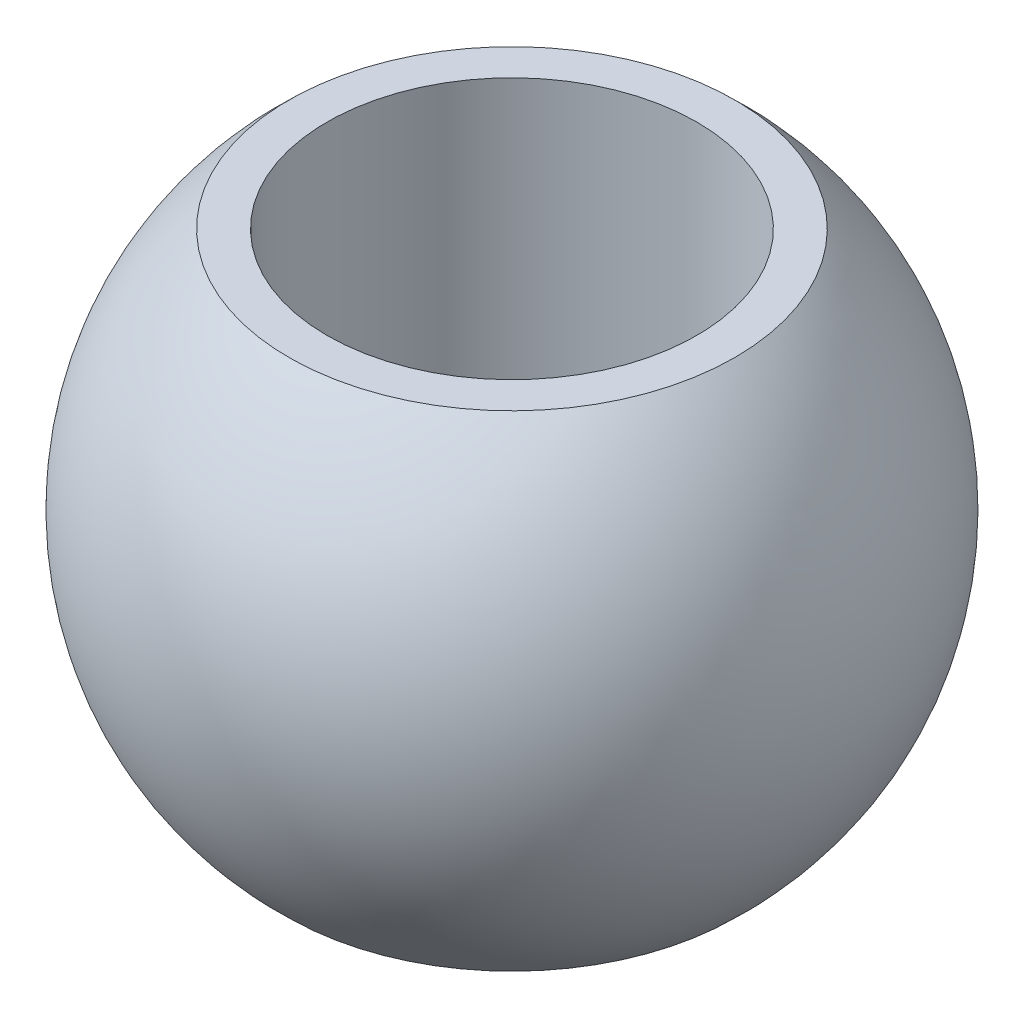
ISO-10303-21;
HEADER;
FILE_DESCRIPTION(('STEP AP214'),'2;1');
FILE_NAME('part.step','',(''),(''),'','','');
FILE_SCHEMA(('AUTOMOTIVE_DESIGN { 1 0 10303 214 1 1 1 1 }'));
ENDSEC;
DATA;
#1=APPLICATION_CONTEXT('core data for automotive mechanical design processes');
#2=APPLICATION_PROTOCOL_DEFINITION('international standard','automotive_design',2000,#1);
#3=PRODUCT_CONTEXT('',#1,'mechanical');
#4=PRODUCT('Part','Part','',(#3));
#5=PRODUCT_RELATED_PRODUCT_CATEGORY('part','',(#4));
#6=PRODUCT_DEFINITION_FORMATION('','',#4);
#7=PRODUCT_DEFINITION_CONTEXT('part definition',#1,'design');
#8=PRODUCT_DEFINITION('design','',#6,#7);
#9=PRODUCT_DEFINITION_SHAPE('','',#8);
#10=(LENGTH_UNIT() NAMED_UNIT(*) SI_UNIT(.MILLI.,.METRE.));
#11=(NAMED_UNIT(*) PLANE_ANGLE_UNIT() SI_UNIT($,.RADIAN.));
#12=(NAMED_UNIT(*) SI_UNIT($,.STERADIAN.) SOLID_ANGLE_UNIT());
#13=UNCERTAINTY_MEASURE_WITH_UNIT(LENGTH_MEASURE(1.E-05),#10,'distance_accuracy_value','');
#14=(GEOMETRIC_REPRESENTATION_CONTEXT(3) GLOBAL_UNCERTAINTY_ASSIGNED_CONTEXT((#13)) GLOBAL_UNIT_ASSIGNED_CONTEXT((#10,
#11,#12)) REPRESENTATION_CONTEXT('',''));
#15=CARTESIAN_POINT('',(0.,0.,0.));
#16=DIRECTION('',(0.,0.,1.));
#17=DIRECTION('',(1.,0.,0.));
#18=AXIS2_PLACEMENT_3D('',#15,#16,#17);
#19=CARTESIAN_POINT('',(8.,-10.5,0.));
#20=DIRECTION('',(0.,-1.,0.));
#21=DIRECTION('',(0.,0.,-1.));
#22=AXIS2_PLACEMENT_3D('',#19,#20,#21);
#23=PLANE('',#22);
#24=CARTESIAN_POINT('',(0.,-10.5,0.));
#25=DIRECTION('',(0.,-1.,0.));
#26=DIRECTION('',(0.,0.,-1.));
#27=AXIS2_PLACEMENT_3D('',#24,#25,#26);
#28=CIRCLE('',#27,9.64870975830447);
#29=CARTESIAN_POINT('',(9.64870975830447,-10.5,0.));
#30=VERTEX_POINT('',#29);
#31=EDGE_CURVE('E10',#30,#30,#28,.T.);
#32=ORIENTED_EDGE('',*,*,#31,.T.);
#33=EDGE_LOOP('',(#32));
#34=FACE_BOUND('',#33,.T.);
#35=CARTESIAN_POINT('',(0.,-10.5,0.));
#36=DIRECTION('',(0.,-1.,0.));
#37=DIRECTION('',(0.,0.,-1.));
#38=AXIS2_PLACEMENT_3D('',#35,#36,#37);
#39=CIRCLE('',#38,8.);
#40=CARTESIAN_POINT('',(0.,-10.5,-8.));
#41=VERTEX_POINT('',#40);
#42=EDGE_CURVE('E44',#41,#41,#39,.T.);
#43=ORIENTED_EDGE('',*,*,#42,.F.);
#44=EDGE_LOOP('',(#43));
#45=FACE_BOUND('',#44,.T.);
#46=ADVANCED_FACE('F30',(#34,#45),#23,.T.);
#47=CARTESIAN_POINT('',(0.,0.,0.));
#48=DIRECTION('',(0.,-1.,0.));
#49=DIRECTION('',(1.,0.,0.));
#50=AXIS2_PLACEMENT_3D('',#47,#48,#49);
#51=SPHERICAL_SURFACE('',#50,14.26);
#52=CARTESIAN_POINT('',(0.,10.5,0.));
#53=DIRECTION('',(0.,-1.,0.));
#54=DIRECTION('',(0.,0.,-1.));
#55=AXIS2_PLACEMENT_3D('',#52,#53,#54);
#56=CIRCLE('',#55,9.64870975830447);
#57=CARTESIAN_POINT('',(9.64870975830447,10.5,0.));
#58=VERTEX_POINT('',#57);
#59=EDGE_CURVE('E36',#58,#58,#56,.T.);
#60=CARTESIAN_POINT('',(9.64870975830447,10.5,0.));
#61=CARTESIAN_POINT('',(9.82975673346771,10.3336397427498,0.));
#62=CARTESIAN_POINT('',(10.0064924702741,10.1625886821683,0.));
#63=CARTESIAN_POINT('',(10.350887841819,9.81158130881758,0.));
#64=CARTESIAN_POINT('',(10.5185474765575,9.63162499604832,0.));
#65=CARTESIAN_POINT('',(10.8443370186121,9.263283472797,0.));
#66=CARTESIAN_POINT('',(11.0024669259283,9.07489826231494,0.));
#67=CARTESIAN_POINT('',(11.3087753855932,8.69020422870869,0.));
#68=CARTESIAN_POINT('',(11.456953937942,8.49389540558451,0.));
#69=CARTESIAN_POINT('',(11.7429629371617,8.09387891734013,0.));
#70=CARTESIAN_POINT('',(11.8807933840327,7.89017125221993,0.));
#71=CARTESIAN_POINT('',(12.1457375703575,7.47590210103879,0.));
#72=CARTESIAN_POINT('',(12.2728513098114,7.26534061497784,0.));
#73=CARTESIAN_POINT('',(12.5160220217294,6.8379270543541,0.));
#74=CARTESIAN_POINT('',(12.6320789941936,6.62107497979131,0.));
#75=CARTESIAN_POINT('',(12.8528257232825,6.18166033502178,0.));
#76=CARTESIAN_POINT('',(12.9575154799073,5.95909776481502,0.));
#77=CARTESIAN_POINT('',(13.1552477271308,5.50885748854886,0.));
#78=CARTESIAN_POINT('',(13.2482902177296,5.28117978248945,0.));
#79=CARTESIAN_POINT('',(13.4224790419134,4.82131827981582,0.));
#80=CARTESIAN_POINT('',(13.5036253754986,4.58913448320159,0.));
#81=CARTESIAN_POINT('',(13.653804816605,4.12088189801269,0.));
#82=CARTESIAN_POINT('',(13.7228379241262,3.884813109438,0.));
#83=CARTESIAN_POINT('',(13.8486062474759,3.40942203156395,0.));
#84=CARTESIAN_POINT('',(13.9053414633044,3.17009974226459,0.));
#85=CARTESIAN_POINT('',(14.0063622348284,2.68884185734506,0.));
#86=CARTESIAN_POINT('',(14.050647790524,2.4469062617249,0.));
#87=CARTESIAN_POINT('',(14.1266507765743,1.96106894925383,0.));
#88=CARTESIAN_POINT('',(14.1583682069291,1.71716723240293,0.));
#89=CARTESIAN_POINT('',(14.2091500972049,1.22805012199137,0.));
#90=CARTESIAN_POINT('',(14.2282145571259,0.982834728430718,0.));
#91=CARTESIAN_POINT('',(14.2536395085235,0.491746223246706,0.));
#92=CARTESIAN_POINT('',(14.26,0.245873111623352,0.));
#93=CARTESIAN_POINT('',(14.26,-0.245873111623355,0.));
#94=CARTESIAN_POINT('',(14.2536395085235,-0.491746223246709,0.));
#95=CARTESIAN_POINT('',(14.2282145571259,-0.982834728430721,0.));
#96=CARTESIAN_POINT('',(14.2091500972049,-1.22805012199138,0.));
#97=CARTESIAN_POINT('',(14.1583682069291,-1.71716723240294,0.));
#98=CARTESIAN_POINT('',(14.1266507765743,-1.96106894925384,0.));
#99=CARTESIAN_POINT('',(14.050647790524,-2.4469062617249,0.));
#100=CARTESIAN_POINT('',(14.0063622348284,-2.68884185734506,0.));
#101=CARTESIAN_POINT('',(13.9053414633044,-3.17009974226459,0.));
#102=CARTESIAN_POINT('',(13.8486062474759,-3.40942203156395,0.));
#103=CARTESIAN_POINT('',(13.7228379241262,-3.884813109438,0.));
#104=CARTESIAN_POINT('',(13.653804816605,-4.12088189801269,0.));
#105=CARTESIAN_POINT('',(13.5036253754986,-4.5891344832016,0.));
#106=CARTESIAN_POINT('',(13.4224790419134,-4.82131827981582,0.));
#107=CARTESIAN_POINT('',(13.2482902177296,-5.28117978248945,0.));
#108=CARTESIAN_POINT('',(13.1552477271308,-5.50885748854887,0.));
#109=CARTESIAN_POINT('',(12.9575154799073,-5.95909776481503,0.));
#110=CARTESIAN_POINT('',(12.8528257232825,-6.18166033502178,0.));
#111=CARTESIAN_POINT('',(12.6320789941936,-6.62107497979132,0.));
#112=CARTESIAN_POINT('',(12.5160220217294,-6.83792705435411,0.));
#113=CARTESIAN_POINT('',(12.2728513098114,-7.26534061497784,0.));
#114=CARTESIAN_POINT('',(12.1457375703575,-7.47590210103879,0.));
#115=CARTESIAN_POINT('',(11.8807933840327,-7.89017125221993,0.));
#116=CARTESIAN_POINT('',(11.7429629371617,-8.09387891734013,0.));
#117=CARTESIAN_POINT('',(11.456953937942,-8.49389540558451,0.));
#118=CARTESIAN_POINT('',(11.3087753855932,-8.69020422870869,0.));
#119=CARTESIAN_POINT('',(11.0024669259283,-9.07489826231494,0.));
#120=CARTESIAN_POINT('',(10.8443370186121,-9.26328347279701,0.));
#121=CARTESIAN_POINT('',(10.5185474765575,-9.63162499604833,0.));
#122=CARTESIAN_POINT('',(10.350887841819,-9.81158130881758,0.));
#123=CARTESIAN_POINT('',(10.0064924702741,-10.1625886821683,0.));
#124=CARTESIAN_POINT('',(9.82975673346771,-10.3336397427498,0.));
#125=CARTESIAN_POINT('',(9.64870975830447,-10.5,0.));
#126=B_SPLINE_CURVE_WITH_KNOTS('',3,(#60,#61,#62,#63,#64,#65,#66,#67,#68,#69,#70,#71,#72,#73,
#74,#75,#76,#77,#78,#79,#80,#81,#82,#83,#84,#85,#86,#87,#88,#89,#90,#91,#92,#93,#94,#95,#96,#97,
#98,#99,#100,#101,#102,#103,#104,#105,#106,#107,#108,#109,#110,#111,#112,#113,#114,#115,#116,
#117,#118,#119,#120,#121,#122,#123,#124,#125),.UNSPECIFIED.,.F.,.F.,(4,2,2,2,2,2,2,2,2,2,2,2,2,
2,2,2,2,2,2,2,2,2,2,2,2,2,2,2,2,2,2,2,4),(0.,0.737537133871472,1.47507426774294,
2.21261140161442,2.95014853548589,3.68768566935736,4.42522280322883,5.1627599371003,
5.90029707097178,6.63783420484325,7.37537133871472,8.11290847258619,8.85044560645766,
9.58798274032914,10.3255198742006,11.0630570080721,11.8005941419436,12.538131275815,
13.2756684096865,14.013205543558,14.7507426774294,15.4882798113009,16.2258169451724,
16.9633540790439,17.7008912129153,18.4384283467868,19.1759654806583,19.9135026145297,
20.6510397484012,21.3885768822727,22.1261140161442,22.8636511500156,23.6011882838871),.UNSPECIFIED.);
#127=EDGE_CURVE('BSEAM54',#58,#30,#126,.T.);
#128=ORIENTED_EDGE('',*,*,#59,.T.);
#129=ORIENTED_EDGE('',*,*,#31,.F.);
#130=ORIENTED_EDGE('',*,*,#127,.T.);
#131=ORIENTED_EDGE('',*,*,#127,.F.);
#132=EDGE_LOOP('',(#128,#130,#129,#131));
#133=FACE_BOUND('',#132,.T.);
#134=ADVANCED_FACE('F54',(#133),#51,.T.);
#135=CARTESIAN_POINT('',(8.,10.5,0.));
#136=DIRECTION('',(0.,1.,0.));
#137=DIRECTION('',(0.,0.,1.));
#138=AXIS2_PLACEMENT_3D('',#135,#136,#137);
#139=PLANE('',#138);
#140=CARTESIAN_POINT('',(0.,10.5,0.));
#141=DIRECTION('',(0.,-1.,0.));
#142=DIRECTION('',(0.,0.,-1.));
#143=AXIS2_PLACEMENT_3D('',#140,#141,#142);
#144=CIRCLE('',#143,8.);
#145=CARTESIAN_POINT('',(0.,10.5,-8.));
#146=VERTEX_POINT('',#145);
#147=EDGE_CURVE('E40',#146,#146,#144,.T.);
#148=ORIENTED_EDGE('',*,*,#147,.T.);
#149=EDGE_LOOP('',(#148));
#150=FACE_BOUND('',#149,.T.);
#151=ORIENTED_EDGE('',*,*,#59,.F.);
#152=EDGE_LOOP('',(#151));
#153=FACE_BOUND('',#152,.T.);
#154=ADVANCED_FACE('F58',(#150,#153),#139,.T.);
#155=CARTESIAN_POINT('',(0.,-11.1,0.));
#156=DIRECTION('',(0.,-1.,0.));
#157=DIRECTION('',(0.,0.,-1.));
#158=AXIS2_PLACEMENT_3D('',#155,#156,#157);
#159=CYLINDRICAL_SURFACE('',#158,8.);
#160=ORIENTED_EDGE('',*,*,#42,.T.);
#161=EDGE_LOOP('',(#160));
#162=FACE_BOUND('',#161,.T.);
#163=ORIENTED_EDGE('',*,*,#147,.F.);
#164=EDGE_LOOP('',(#163));
#165=FACE_BOUND('',#164,.T.);
#166=ADVANCED_FACE('F50',(#162,#165),#159,.F.);
#167=CLOSED_SHELL('',(#46,#134,#154,#166));
#168=MANIFOLD_SOLID_BREP('B2',#167);
#169=ADVANCED_BREP_SHAPE_REPRESENTATION('',(#18,#168),#14);
#170=SHAPE_DEFINITION_REPRESENTATION(#9,#169);
ENDSEC;
END-ISO-10303-21;
